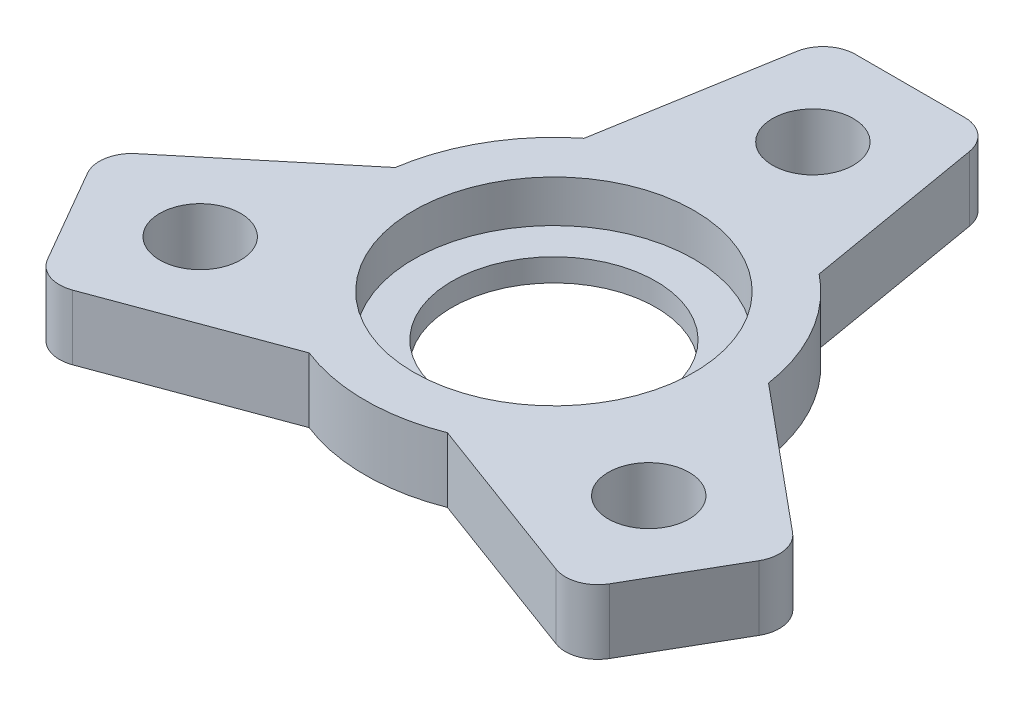
ISO-10303-21;
HEADER;
FILE_DESCRIPTION(('STEP AP214'),'2;1');
FILE_NAME('part.step','',(''),(''),'','','');
FILE_SCHEMA(('AUTOMOTIVE_DESIGN { 1 0 10303 214 1 1 1 1 }'));
ENDSEC;
DATA;
#1=APPLICATION_CONTEXT('core data for automotive mechanical design processes');
#2=APPLICATION_PROTOCOL_DEFINITION('international standard','automotive_design',2000,#1);
#3=PRODUCT_CONTEXT('',#1,'mechanical');
#4=PRODUCT('Part','Part','',(#3));
#5=PRODUCT_RELATED_PRODUCT_CATEGORY('part','',(#4));
#6=PRODUCT_DEFINITION_FORMATION('','',#4);
#7=PRODUCT_DEFINITION_CONTEXT('part definition',#1,'design');
#8=PRODUCT_DEFINITION('design','',#6,#7);
#9=PRODUCT_DEFINITION_SHAPE('','',#8);
#10=(LENGTH_UNIT() NAMED_UNIT(*) SI_UNIT(.MILLI.,.METRE.));
#11=(NAMED_UNIT(*) PLANE_ANGLE_UNIT() SI_UNIT($,.RADIAN.));
#12=(NAMED_UNIT(*) SI_UNIT($,.STERADIAN.) SOLID_ANGLE_UNIT());
#13=UNCERTAINTY_MEASURE_WITH_UNIT(LENGTH_MEASURE(1.E-05),#10,'distance_accuracy_value','');
#14=(GEOMETRIC_REPRESENTATION_CONTEXT(3) GLOBAL_UNCERTAINTY_ASSIGNED_CONTEXT((#13)) GLOBAL_UNIT_ASSIGNED_CONTEXT((#10,
#11,#12)) REPRESENTATION_CONTEXT('',''));
#15=CARTESIAN_POINT('',(0.,0.,0.));
#16=DIRECTION('',(0.,0.,1.));
#17=DIRECTION('',(1.,0.,0.));
#18=AXIS2_PLACEMENT_3D('',#15,#16,#17);
#19=CARTESIAN_POINT('',(0.,0.,0.));
#20=DIRECTION('',(0.,1.,0.));
#21=DIRECTION('',(0.,0.,1.));
#22=AXIS2_PLACEMENT_3D('',#19,#20,#21);
#23=PLANE('',#22);
#24=CARTESIAN_POINT('',(0.,0.,0.));
#25=DIRECTION('',(0.,1.,0.));
#26=DIRECTION('',(0.,0.,1.));
#27=AXIS2_PLACEMENT_3D('',#24,#25,#26);
#28=CIRCLE('',#27,8.);
#29=CARTESIAN_POINT('',(0.,0.,8.));
#30=VERTEX_POINT('',#29);
#31=EDGE_CURVE('E235',#30,#30,#28,.T.);
#32=ORIENTED_EDGE('',*,*,#31,.T.);
#33=EDGE_LOOP('',(#32));
#34=FACE_BOUND('',#33,.T.);
#35=DIRECTION('',(-0.499999999999992,0.,0.866025403784443));
#36=VECTOR('',#35,1.);
#37=CARTESIAN_POINT('',(24.1967497817373,0.,13.9699999999998));
#38=LINE('',#37,#36);
#39=CARTESIAN_POINT('',(26.3396179972549,0.,10.2584433767988));
#40=VERTEX_POINT('',#39);
#41=CARTESIAN_POINT('',(22.0538815662198,0.,17.6815566232007));
#42=VERTEX_POINT('',#41);
#43=EDGE_CURVE('E370',#40,#42,#38,.T.);
#44=ORIENTED_EDGE('',*,*,#43,.T.);
#45=CARTESIAN_POINT('',(19.8541770406073,0.,16.4115566232007));
#46=DIRECTION('',(0.,1.,0.));
#47=DIRECTION('',(0.,0.,1.));
#48=AXIS2_PLACEMENT_3D('',#45,#46,#47);
#49=CIRCLE('',#48,2.54);
#50=CARTESIAN_POINT('',(18.9727429635595,0.,18.7937140419745));
#51=VERTEX_POINT('',#50);
#52=EDGE_CURVE('E348',#42,#51,#49,.F.);
#53=ORIENTED_EDGE('',*,*,#52,.T.);
#54=DIRECTION('',(0.937857251485738,0.,0.34702129017629));
#55=VECTOR('',#54,1.);
#56=CARTESIAN_POINT('',(-3.83176579703126,0.,10.3557027781067));
#57=LINE('',#56,#55);
#58=CARTESIAN_POINT('',(5.42470429866146,0.,13.7807359481301));
#59=VERTEX_POINT('',#58);
#60=EDGE_CURVE('E183',#59,#51,#57,.T.);
#61=ORIENTED_EDGE('',*,*,#60,.F.);
#62=CARTESIAN_POINT('',(0.,0.,0.));
#63=DIRECTION('',(0.,1.,0.));
#64=DIRECTION('',(0.,0.,1.));
#65=AXIS2_PLACEMENT_3D('',#62,#63,#64);
#66=CIRCLE('',#65,14.81);
#67=CARTESIAN_POINT('',(-5.42470429866127,0.,13.7807359481301));
#68=VERTEX_POINT('',#67);
#69=EDGE_CURVE('E177',#68,#59,#66,.T.);
#70=ORIENTED_EDGE('',*,*,#69,.F.);
#71=DIRECTION('',(-0.937857251485733,0.,0.347021290176303));
#72=VECTOR('',#71,1.);
#73=CARTESIAN_POINT('',(3.83176579703141,0.,10.3557027781067));
#74=LINE('',#73,#72);
#75=CARTESIAN_POINT('',(-18.9727429635593,0.,18.7937140419748));
#76=VERTEX_POINT('',#75);
#77=EDGE_CURVE('E182',#68,#76,#74,.T.);
#78=ORIENTED_EDGE('',*,*,#77,.T.);
#79=CARTESIAN_POINT('',(-19.8541770406071,0.,16.411556623201));
#80=DIRECTION('',(0.,1.,0.));
#81=DIRECTION('',(0.,0.,1.));
#82=AXIS2_PLACEMENT_3D('',#79,#80,#81);
#83=CIRCLE('',#82,2.54);
#84=CARTESIAN_POINT('',(-22.0538815662195,0.,17.681556623201));
#85=VERTEX_POINT('',#84);
#86=EDGE_CURVE('E321',#76,#85,#83,.F.);
#87=ORIENTED_EDGE('',*,*,#86,.T.);
#88=DIRECTION('',(-0.500000000000004,0.,-0.866025403784436));
#89=VECTOR('',#88,1.);
#90=CARTESIAN_POINT('',(-24.1967497817372,0.,13.9700000000001));
#91=LINE('',#90,#89);
#92=CARTESIAN_POINT('',(-26.3396179972548,0.,10.2584433767992));
#93=VERTEX_POINT('',#92);
#94=EDGE_CURVE('E213',#85,#93,#91,.T.);
#95=ORIENTED_EDGE('',*,*,#94,.T.);
#96=CARTESIAN_POINT('',(-24.1399134716423,0.,8.98844337679918));
#97=DIRECTION('',(0.,1.,0.));
#98=DIRECTION('',(0.,0.,1.));
#99=AXIS2_PLACEMENT_3D('',#96,#97,#98);
#100=CIRCLE('',#99,2.54);
#101=CARTESIAN_POINT('',(-25.7622052735901,0.,7.03402036492763));
#102=VERTEX_POINT('',#101);
#103=EDGE_CURVE('E324',#93,#102,#100,.F.);
#104=ORIENTED_EDGE('',*,*,#103,.T.);
#105=DIRECTION('',(-0.769457878689591,0.,0.638697559821952));
#106=VECTOR('',#105,1.);
#107=CARTESIAN_POINT('',(-7.05241878136586,0.,-8.49625791063481));
#108=LINE('',#107,#106);
#109=CARTESIAN_POINT('',(-14.6468195632568,0.,-2.19243624340563));
#110=VERTEX_POINT('',#109);
#111=EDGE_CURVE('E207',#110,#102,#108,.T.);
#112=ORIENTED_EDGE('',*,*,#111,.F.);
#113=CARTESIAN_POINT('',(-9.22211526459544,0.,-11.5882997047244));
#114=VERTEX_POINT('',#113);
#115=EDGE_CURVE('E187',#114,#110,#66,.T.);
#116=ORIENTED_EDGE('',*,*,#115,.F.);
#117=DIRECTION('',(0.168399372796141,0.,-0.985718849998247));
#118=VECTOR('',#117,1.);
#119=CARTESIAN_POINT('',(-10.8841845783972,0.,-1.85944486747187));
#120=LINE('',#119,#118);
#121=CARTESIAN_POINT('',(-6.78946231003074,0.,-25.8277344069022));
#122=VERTEX_POINT('',#121);
#123=EDGE_CURVE('E240',#114,#122,#120,.T.);
#124=ORIENTED_EDGE('',*,*,#123,.T.);
#125=CARTESIAN_POINT('',(-4.2857364310352,0.,-25.4));
#126=DIRECTION('',(0.,1.,0.));
#127=DIRECTION('',(0.,0.,1.));
#128=AXIS2_PLACEMENT_3D('',#125,#126,#127);
#129=CIRCLE('',#128,2.54);
#130=CARTESIAN_POINT('',(-4.2857364310352,0.,-27.94));
#131=VERTEX_POINT('',#130);
#132=EDGE_CURVE('E295',#122,#131,#129,.F.);
#133=ORIENTED_EDGE('',*,*,#132,.T.);
#134=DIRECTION('',(1.,0.,0.));
#135=VECTOR('',#134,1.);
#136=CARTESIAN_POINT('',(0.,0.,-27.94));
#137=LINE('',#136,#135);
#138=CARTESIAN_POINT('',(4.28573643103519,0.,-27.94));
#139=VERTEX_POINT('',#138);
#140=EDGE_CURVE('E249',#131,#139,#137,.T.);
#141=ORIENTED_EDGE('',*,*,#140,.T.);
#142=CARTESIAN_POINT('',(4.28573643103519,0.,-25.4));
#143=DIRECTION('',(0.,1.,0.));
#144=DIRECTION('',(0.,0.,1.));
#145=AXIS2_PLACEMENT_3D('',#142,#143,#144);
#146=CIRCLE('',#145,2.54);
#147=CARTESIAN_POINT('',(6.78946231003074,0.,-25.8277344069022));
#148=VERTEX_POINT('',#147);
#149=EDGE_CURVE('E298',#139,#148,#146,.F.);
#150=ORIENTED_EDGE('',*,*,#149,.T.);
#151=DIRECTION('',(-0.168399372796141,0.,-0.985718849998247));
#152=VECTOR('',#151,1.);
#153=CARTESIAN_POINT('',(10.8841845783972,0.,-1.85944486747187));
#154=LINE('',#153,#152);
#155=CARTESIAN_POINT('',(9.22211526459544,0.,-11.5882997047244));
#156=VERTEX_POINT('',#155);
#157=EDGE_CURVE('E271',#156,#148,#154,.T.);
#158=ORIENTED_EDGE('',*,*,#157,.F.);
#159=CARTESIAN_POINT('',(14.6468195632567,0.,-2.19243624340584));
#160=VERTEX_POINT('',#159);
#161=EDGE_CURVE('E188',#160,#156,#66,.T.);
#162=ORIENTED_EDGE('',*,*,#161,.F.);
#163=DIRECTION('',(0.769457878689599,0.,0.638697559821941));
#164=VECTOR('',#163,1.);
#165=CARTESIAN_POINT('',(7.05241878136574,0.,-8.49625791063491));
#166=LINE('',#165,#164);
#167=CARTESIAN_POINT('',(25.7622052735901,0.,7.03402036492725));
#168=VERTEX_POINT('',#167);
#169=EDGE_CURVE('E373',#160,#168,#166,.T.);
#170=ORIENTED_EDGE('',*,*,#169,.T.);
#171=CARTESIAN_POINT('',(24.1399134716424,0.,8.98844337679884));
#172=DIRECTION('',(0.,1.,0.));
#173=DIRECTION('',(0.,0.,1.));
#174=AXIS2_PLACEMENT_3D('',#171,#172,#173);
#175=CIRCLE('',#174,2.54);
#176=EDGE_CURVE('E345',#168,#40,#175,.F.);
#177=ORIENTED_EDGE('',*,*,#176,.T.);
#178=EDGE_LOOP('',(#44,#53,#61,#70,#78,#87,#95,#104,#112,#116,#124,#133,#141,#150,#158,#162,
#170,#177));
#179=FACE_BOUND('',#178,.T.);
#180=CARTESIAN_POINT('',(0.,0.,-20.32));
#181=DIRECTION('',(0.,-1.,0.));
#182=DIRECTION('',(0.,0.,-1.));
#183=AXIS2_PLACEMENT_3D('',#180,#181,#182);
#184=CIRCLE('',#183,3.17499999999999);
#185=CARTESIAN_POINT('',(0.,0.,-23.495));
#186=VERTEX_POINT('',#185);
#187=EDGE_CURVE('E199',#186,#186,#184,.T.);
#188=ORIENTED_EDGE('',*,*,#187,.F.);
#189=EDGE_LOOP('',(#188));
#190=FACE_BOUND('',#189,.T.);
#191=CARTESIAN_POINT('',(-17.5976362048998,0.,10.1600000000001));
#192=DIRECTION('',(0.,-1.,0.));
#193=DIRECTION('',(0.,0.,-1.));
#194=AXIS2_PLACEMENT_3D('',#191,#192,#193);
#195=CIRCLE('',#194,3.17499999999999);
#196=CARTESIAN_POINT('',(-17.5976362048998,0.,6.9850000000001));
#197=VERTEX_POINT('',#196);
#198=EDGE_CURVE('E449',#197,#197,#195,.T.);
#199=ORIENTED_EDGE('',*,*,#198,.F.);
#200=EDGE_LOOP('',(#199));
#201=FACE_BOUND('',#200,.T.);
#202=CARTESIAN_POINT('',(17.5976362048999,0.,10.1599999999998));
#203=DIRECTION('',(0.,-1.,0.));
#204=DIRECTION('',(0.,0.,-1.));
#205=AXIS2_PLACEMENT_3D('',#202,#203,#204);
#206=CIRCLE('',#205,3.17499999999999);
#207=CARTESIAN_POINT('',(17.5976362048999,0.,6.98499999999985));
#208=VERTEX_POINT('',#207);
#209=EDGE_CURVE('E457',#208,#208,#206,.T.);
#210=ORIENTED_EDGE('',*,*,#209,.F.);
#211=EDGE_LOOP('',(#210));
#212=FACE_BOUND('',#211,.T.);
#213=ADVANCED_FACE('F47',(#34,#179,#190,#201,#212),#23,.F.);
#214=CARTESIAN_POINT('',(0.,5.08,0.));
#215=DIRECTION('',(0.,1.,0.));
#216=DIRECTION('',(0.,0.,1.));
#217=AXIS2_PLACEMENT_3D('',#214,#215,#216);
#218=PLANE('',#217);
#219=CARTESIAN_POINT('',(0.,5.08,-20.32));
#220=DIRECTION('',(0.,-1.,0.));
#221=DIRECTION('',(0.,0.,-1.));
#222=AXIS2_PLACEMENT_3D('',#219,#220,#221);
#223=CIRCLE('',#222,3.175);
#224=CARTESIAN_POINT('',(0.,5.08,-23.495));
#225=VERTEX_POINT('',#224);
#226=EDGE_CURVE('E231',#225,#225,#223,.T.);
#227=ORIENTED_EDGE('',*,*,#226,.T.);
#228=EDGE_LOOP('',(#227));
#229=FACE_BOUND('',#228,.T.);
#230=CARTESIAN_POINT('',(0.,5.08,0.));
#231=DIRECTION('',(0.,1.,0.));
#232=DIRECTION('',(0.,0.,1.));
#233=AXIS2_PLACEMENT_3D('',#230,#231,#232);
#234=CIRCLE('',#233,11.);
#235=CARTESIAN_POINT('',(0.,5.08,11.));
#236=VERTEX_POINT('',#235);
#237=EDGE_CURVE('E262',#236,#236,#234,.T.);
#238=ORIENTED_EDGE('',*,*,#237,.F.);
#239=EDGE_LOOP('',(#238));
#240=FACE_BOUND('',#239,.T.);
#241=DIRECTION('',(0.937857251485738,0.,0.34702129017629));
#242=VECTOR('',#241,1.);
#243=CARTESIAN_POINT('',(-3.83176579703126,5.08,10.3557027781067));
#244=LINE('',#243,#242);
#245=CARTESIAN_POINT('',(5.42470429866146,5.08,13.7807359481301));
#246=VERTEX_POINT('',#245);
#247=CARTESIAN_POINT('',(18.9727429635595,5.08,18.7937140419745));
#248=VERTEX_POINT('',#247);
#249=EDGE_CURVE('E360',#246,#248,#244,.T.);
#250=ORIENTED_EDGE('',*,*,#249,.T.);
#251=CARTESIAN_POINT('',(19.8541770406073,5.08,16.4115566232007));
#252=DIRECTION('',(0.,1.,0.));
#253=DIRECTION('',(0.,0.,1.));
#254=AXIS2_PLACEMENT_3D('',#251,#252,#253);
#255=CIRCLE('',#254,2.54);
#256=CARTESIAN_POINT('',(22.0538815662198,5.08,17.6815566232007));
#257=VERTEX_POINT('',#256);
#258=EDGE_CURVE('E56',#248,#257,#255,.T.);
#259=ORIENTED_EDGE('',*,*,#258,.T.);
#260=DIRECTION('',(-0.499999999999992,0.,0.866025403784443));
#261=VECTOR('',#260,1.);
#262=CARTESIAN_POINT('',(24.1967497817373,5.08,13.9699999999998));
#263=LINE('',#262,#261);
#264=CARTESIAN_POINT('',(26.3396179972549,5.08,10.2584433767988));
#265=VERTEX_POINT('',#264);
#266=EDGE_CURVE('E359',#265,#257,#263,.T.);
#267=ORIENTED_EDGE('',*,*,#266,.F.);
#268=CARTESIAN_POINT('',(24.1399134716424,5.08,8.98844337679884));
#269=DIRECTION('',(0.,1.,0.));
#270=DIRECTION('',(0.,0.,1.));
#271=AXIS2_PLACEMENT_3D('',#268,#269,#270);
#272=CIRCLE('',#271,2.54);
#273=CARTESIAN_POINT('',(25.7622052735901,5.08,7.03402036492725));
#274=VERTEX_POINT('',#273);
#275=EDGE_CURVE('E63',#265,#274,#272,.T.);
#276=ORIENTED_EDGE('',*,*,#275,.T.);
#277=DIRECTION('',(0.769457878689599,0.,0.638697559821941));
#278=VECTOR('',#277,1.);
#279=CARTESIAN_POINT('',(7.05241878136574,5.08,-8.49625791063491));
#280=LINE('',#279,#278);
#281=CARTESIAN_POINT('',(14.6468195632567,5.08,-2.19243624340584));
#282=VERTEX_POINT('',#281);
#283=EDGE_CURVE('E377',#282,#274,#280,.T.);
#284=ORIENTED_EDGE('',*,*,#283,.F.);
#285=CARTESIAN_POINT('',(0.,5.08,0.));
#286=DIRECTION('',(0.,1.,0.));
#287=DIRECTION('',(0.,0.,1.));
#288=AXIS2_PLACEMENT_3D('',#285,#286,#287);
#289=CIRCLE('',#288,14.81);
#290=CARTESIAN_POINT('',(9.22211526459544,5.08,-11.5882997047244));
#291=VERTEX_POINT('',#290);
#292=EDGE_CURVE('E248',#282,#291,#289,.T.);
#293=ORIENTED_EDGE('',*,*,#292,.T.);
#294=DIRECTION('',(-0.168399372796141,0.,-0.985718849998247));
#295=VECTOR('',#294,1.);
#296=CARTESIAN_POINT('',(10.8841845783972,5.08,-1.85944486747187));
#297=LINE('',#296,#295);
#298=CARTESIAN_POINT('',(6.78946231003074,5.08,-25.8277344069022));
#299=VERTEX_POINT('',#298);
#300=EDGE_CURVE('E254',#291,#299,#297,.T.);
#301=ORIENTED_EDGE('',*,*,#300,.T.);
#302=CARTESIAN_POINT('',(4.28573643103519,5.08,-25.4));
#303=DIRECTION('',(0.,1.,0.));
#304=DIRECTION('',(0.,0.,1.));
#305=AXIS2_PLACEMENT_3D('',#302,#303,#304);
#306=CIRCLE('',#305,2.54);
#307=CARTESIAN_POINT('',(4.28573643103519,5.08,-27.94));
#308=VERTEX_POINT('',#307);
#309=EDGE_CURVE('E307',#299,#308,#306,.T.);
#310=ORIENTED_EDGE('',*,*,#309,.T.);
#311=DIRECTION('',(1.,0.,0.));
#312=VECTOR('',#311,1.);
#313=CARTESIAN_POINT('',(0.,5.08,-27.94));
#314=LINE('',#313,#312);
#315=CARTESIAN_POINT('',(-4.2857364310352,5.08,-27.94));
#316=VERTEX_POINT('',#315);
#317=EDGE_CURVE('E258',#316,#308,#314,.T.);
#318=ORIENTED_EDGE('',*,*,#317,.F.);
#319=CARTESIAN_POINT('',(-4.2857364310352,5.08,-25.4));
#320=DIRECTION('',(0.,1.,0.));
#321=DIRECTION('',(0.,0.,1.));
#322=AXIS2_PLACEMENT_3D('',#319,#320,#321);
#323=CIRCLE('',#322,2.54);
#324=CARTESIAN_POINT('',(-6.78946231003074,5.08,-25.8277344069022));
#325=VERTEX_POINT('',#324);
#326=EDGE_CURVE('E304',#316,#325,#323,.T.);
#327=ORIENTED_EDGE('',*,*,#326,.T.);
#328=DIRECTION('',(0.168399372796141,0.,-0.985718849998247));
#329=VECTOR('',#328,1.);
#330=CARTESIAN_POINT('',(-10.8841845783972,5.08,-1.85944486747187));
#331=LINE('',#330,#329);
#332=CARTESIAN_POINT('',(-9.22211526459544,5.08,-11.5882997047244));
#333=VERTEX_POINT('',#332);
#334=EDGE_CURVE('E244',#333,#325,#331,.T.);
#335=ORIENTED_EDGE('',*,*,#334,.F.);
#336=CARTESIAN_POINT('',(-14.6468195632568,5.08,-2.19243624340563));
#337=VERTEX_POINT('',#336);
#338=EDGE_CURVE('E250',#333,#337,#289,.T.);
#339=ORIENTED_EDGE('',*,*,#338,.T.);
#340=DIRECTION('',(-0.769457878689591,0.,0.638697559821952));
#341=VECTOR('',#340,1.);
#342=CARTESIAN_POINT('',(-7.05241878136586,5.08,-8.49625791063481));
#343=LINE('',#342,#341);
#344=CARTESIAN_POINT('',(-25.7622052735901,5.08,7.03402036492763));
#345=VERTEX_POINT('',#344);
#346=EDGE_CURVE('E386',#337,#345,#343,.T.);
#347=ORIENTED_EDGE('',*,*,#346,.T.);
#348=CARTESIAN_POINT('',(-24.1399134716423,5.08,8.98844337679918));
#349=DIRECTION('',(0.,1.,0.));
#350=DIRECTION('',(0.,0.,1.));
#351=AXIS2_PLACEMENT_3D('',#348,#349,#350);
#352=CIRCLE('',#351,2.54);
#353=CARTESIAN_POINT('',(-26.3396179972548,5.08,10.2584433767992));
#354=VERTEX_POINT('',#353);
#355=EDGE_CURVE('E333',#345,#354,#352,.T.);
#356=ORIENTED_EDGE('',*,*,#355,.T.);
#357=DIRECTION('',(-0.500000000000004,0.,-0.866025403784436));
#358=VECTOR('',#357,1.);
#359=CARTESIAN_POINT('',(-24.1967497817372,5.08,13.9700000000001));
#360=LINE('',#359,#358);
#361=CARTESIAN_POINT('',(-22.0538815662195,5.08,17.681556623201));
#362=VERTEX_POINT('',#361);
#363=EDGE_CURVE('E218',#362,#354,#360,.T.);
#364=ORIENTED_EDGE('',*,*,#363,.F.);
#365=CARTESIAN_POINT('',(-19.8541770406071,5.08,16.411556623201));
#366=DIRECTION('',(0.,1.,0.));
#367=DIRECTION('',(0.,0.,1.));
#368=AXIS2_PLACEMENT_3D('',#365,#366,#367);
#369=CIRCLE('',#368,2.54);
#370=CARTESIAN_POINT('',(-18.9727429635593,5.08,18.7937140419748));
#371=VERTEX_POINT('',#370);
#372=EDGE_CURVE('E330',#362,#371,#369,.T.);
#373=ORIENTED_EDGE('',*,*,#372,.T.);
#374=DIRECTION('',(-0.937857251485733,0.,0.347021290176303));
#375=VECTOR('',#374,1.);
#376=CARTESIAN_POINT('',(3.83176579703141,5.08,10.3557027781067));
#377=LINE('',#376,#375);
#378=CARTESIAN_POINT('',(-5.42470429866126,5.08,13.7807359481301));
#379=VERTEX_POINT('',#378);
#380=EDGE_CURVE('E224',#379,#371,#377,.T.);
#381=ORIENTED_EDGE('',*,*,#380,.F.);
#382=EDGE_CURVE('E194',#379,#246,#289,.T.);
#383=ORIENTED_EDGE('',*,*,#382,.T.);
#384=EDGE_LOOP('',(#250,#259,#267,#276,#284,#293,#301,#310,#318,#327,#335,#339,#347,#356,#364,
#373,#381,#383));
#385=FACE_BOUND('',#384,.T.);
#386=CARTESIAN_POINT('',(-17.5976362048998,5.08,10.1600000000001));
#387=DIRECTION('',(0.,-1.,0.));
#388=DIRECTION('',(0.,0.,-1.));
#389=AXIS2_PLACEMENT_3D('',#386,#387,#388);
#390=CIRCLE('',#389,3.175);
#391=CARTESIAN_POINT('',(-17.5976362048998,5.08,6.98500000000008));
#392=VERTEX_POINT('',#391);
#393=EDGE_CURVE('E380',#392,#392,#390,.T.);
#394=ORIENTED_EDGE('',*,*,#393,.T.);
#395=EDGE_LOOP('',(#394));
#396=FACE_BOUND('',#395,.T.);
#397=CARTESIAN_POINT('',(17.5976362048999,5.08,10.1599999999998));
#398=DIRECTION('',(0.,-1.,0.));
#399=DIRECTION('',(0.,0.,-1.));
#400=AXIS2_PLACEMENT_3D('',#397,#398,#399);
#401=CIRCLE('',#400,3.175);
#402=CARTESIAN_POINT('',(17.5976362048999,5.08,6.98499999999984));
#403=VERTEX_POINT('',#402);
#404=EDGE_CURVE('E453',#403,#403,#401,.T.);
#405=ORIENTED_EDGE('',*,*,#404,.T.);
#406=EDGE_LOOP('',(#405));
#407=FACE_BOUND('',#406,.T.);
#408=ADVANCED_FACE('F357',(#229,#240,#385,#396,#407),#218,.T.);
#409=CARTESIAN_POINT('',(0.,5.08,0.));
#410=DIRECTION('',(0.,-1.,0.));
#411=DIRECTION('',(0.,0.,-1.));
#412=AXIS2_PLACEMENT_3D('',#409,#410,#411);
#413=CYLINDRICAL_SURFACE('',#412,14.81);
#414=DIRECTION('',(0.,-1.,0.));
#415=VECTOR('',#414,1.);
#416=CARTESIAN_POINT('',(-14.6468195632568,5.08,-2.19243624340562));
#417=LINE('',#416,#415);
#418=EDGE_CURVE('E200',#337,#110,#417,.T.);
#419=ORIENTED_EDGE('',*,*,#418,.F.);
#420=ORIENTED_EDGE('',*,*,#338,.F.);
#421=DIRECTION('',(0.,-1.,0.));
#422=VECTOR('',#421,1.);
#423=CARTESIAN_POINT('',(-9.22211526459544,5.08,-11.5882997047244));
#424=LINE('',#423,#422);
#425=EDGE_CURVE('E281',#333,#114,#424,.T.);
#426=ORIENTED_EDGE('',*,*,#425,.T.);
#427=ORIENTED_EDGE('',*,*,#115,.T.);
#428=EDGE_LOOP('',(#419,#420,#426,#427));
#429=FACE_BOUND('',#428,.T.);
#430=ADVANCED_FACE('F409',(#429),#413,.T.);
#431=ORIENTED_EDGE('',*,*,#382,.F.);
#432=DIRECTION('',(0.,-1.,0.));
#433=VECTOR('',#432,1.);
#434=CARTESIAN_POINT('',(-5.42470429866127,5.08,13.7807359481301));
#435=LINE('',#434,#433);
#436=EDGE_CURVE('E191',#379,#68,#435,.T.);
#437=ORIENTED_EDGE('',*,*,#436,.T.);
#438=ORIENTED_EDGE('',*,*,#69,.T.);
#439=DIRECTION('',(0.,-1.,0.));
#440=VECTOR('',#439,1.);
#441=CARTESIAN_POINT('',(5.42470429866146,5.08,13.78073594813));
#442=LINE('',#441,#440);
#443=EDGE_CURVE('E215',#246,#59,#442,.T.);
#444=ORIENTED_EDGE('',*,*,#443,.F.);
#445=EDGE_LOOP('',(#431,#437,#438,#444));
#446=FACE_BOUND('',#445,.T.);
#447=ADVANCED_FACE('F192',(#446),#413,.T.);
#448=CARTESIAN_POINT('',(-10.8841845783972,5.08,-1.85944486747187));
#449=DIRECTION('',(-0.985718849998247,0.,-0.168399372796141));
#450=DIRECTION('',(-0.168399372796141,0.,0.985718849998247));
#451=AXIS2_PLACEMENT_3D('',#448,#449,#450);
#452=PLANE('',#451);
#453=ORIENTED_EDGE('',*,*,#334,.T.);
#454=DIRECTION('',(0.,-1.,0.));
#455=VECTOR('',#454,1.);
#456=CARTESIAN_POINT('',(-6.78946231003074,5.08,-25.8277344069022));
#457=LINE('',#456,#455);
#458=EDGE_CURVE('E310',#325,#122,#457,.T.);
#459=ORIENTED_EDGE('',*,*,#458,.T.);
#460=ORIENTED_EDGE('',*,*,#123,.F.);
#461=ORIENTED_EDGE('',*,*,#425,.F.);
#462=EDGE_LOOP('',(#453,#459,#460,#461));
#463=FACE_BOUND('',#462,.T.);
#464=ADVANCED_FACE('F415',(#463),#452,.T.);
#465=ORIENTED_EDGE('',*,*,#292,.F.);
#466=DIRECTION('',(0.,-1.,0.));
#467=VECTOR('',#466,1.);
#468=CARTESIAN_POINT('',(14.6468195632567,5.08,-2.19243624340583));
#469=LINE('',#468,#467);
#470=EDGE_CURVE('E208',#282,#160,#469,.T.);
#471=ORIENTED_EDGE('',*,*,#470,.T.);
#472=ORIENTED_EDGE('',*,*,#161,.T.);
#473=DIRECTION('',(0.,-1.,0.));
#474=VECTOR('',#473,1.);
#475=CARTESIAN_POINT('',(9.22211526459544,5.08,-11.5882997047244));
#476=LINE('',#475,#474);
#477=EDGE_CURVE('E266',#291,#156,#476,.T.);
#478=ORIENTED_EDGE('',*,*,#477,.F.);
#479=EDGE_LOOP('',(#465,#471,#472,#478));
#480=FACE_BOUND('',#479,.T.);
#481=ADVANCED_FACE('F435',(#480),#413,.T.);
#482=CARTESIAN_POINT('',(10.8841845783972,5.08,-1.85944486747187));
#483=DIRECTION('',(-0.985718849998247,0.,0.168399372796141));
#484=DIRECTION('',(0.168399372796141,0.,0.985718849998247));
#485=AXIS2_PLACEMENT_3D('',#482,#483,#484);
#486=PLANE('',#485);
#487=ORIENTED_EDGE('',*,*,#157,.T.);
#488=DIRECTION('',(0.,-1.,0.));
#489=VECTOR('',#488,1.);
#490=CARTESIAN_POINT('',(6.78946231003074,5.08,-25.8277344069022));
#491=LINE('',#490,#489);
#492=EDGE_CURVE('E301',#148,#299,#491,.F.);
#493=ORIENTED_EDGE('',*,*,#492,.T.);
#494=ORIENTED_EDGE('',*,*,#300,.F.);
#495=ORIENTED_EDGE('',*,*,#477,.T.);
#496=EDGE_LOOP('',(#487,#493,#494,#495));
#497=FACE_BOUND('',#496,.T.);
#498=ADVANCED_FACE('F431',(#497),#486,.F.);
#499=CARTESIAN_POINT('',(0.,5.08,-27.94));
#500=DIRECTION('',(0.,0.,-1.));
#501=DIRECTION('',(-1.,0.,0.));
#502=AXIS2_PLACEMENT_3D('',#499,#500,#501);
#503=PLANE('',#502);
#504=ORIENTED_EDGE('',*,*,#317,.T.);
#505=DIRECTION('',(0.,-1.,0.));
#506=VECTOR('',#505,1.);
#507=CARTESIAN_POINT('',(4.28573643103519,0.,-27.94));
#508=LINE('',#507,#506);
#509=EDGE_CURVE('E291',#308,#139,#508,.T.);
#510=ORIENTED_EDGE('',*,*,#509,.T.);
#511=ORIENTED_EDGE('',*,*,#140,.F.);
#512=DIRECTION('',(0.,-1.,0.));
#513=VECTOR('',#512,1.);
#514=CARTESIAN_POINT('',(-4.2857364310352,5.08,-27.94));
#515=LINE('',#514,#513);
#516=EDGE_CURVE('E288',#131,#316,#515,.F.);
#517=ORIENTED_EDGE('',*,*,#516,.T.);
#518=EDGE_LOOP('',(#504,#510,#511,#517));
#519=FACE_BOUND('',#518,.T.);
#520=ADVANCED_FACE('F422',(#519),#503,.T.);
#521=CARTESIAN_POINT('',(0.,5.08,0.));
#522=DIRECTION('',(0.,-1.,0.));
#523=DIRECTION('',(0.,0.,-1.));
#524=AXIS2_PLACEMENT_3D('',#521,#522,#523);
#525=CYLINDRICAL_SURFACE('',#524,11.);
#526=CARTESIAN_POINT('',(0.,1.778,0.));
#527=DIRECTION('',(0.,1.,0.));
#528=DIRECTION('',(0.,0.,1.));
#529=AXIS2_PLACEMENT_3D('',#526,#527,#528);
#530=CIRCLE('',#529,11.);
#531=CARTESIAN_POINT('',(0.,1.778,11.));
#532=VERTEX_POINT('',#531);
#533=EDGE_CURVE('E284',#532,#532,#530,.T.);
#534=ORIENTED_EDGE('',*,*,#533,.F.);
#535=EDGE_LOOP('',(#534));
#536=FACE_BOUND('',#535,.T.);
#537=ORIENTED_EDGE('',*,*,#237,.T.);
#538=EDGE_LOOP('',(#537));
#539=FACE_BOUND('',#538,.T.);
#540=ADVANCED_FACE('F475',(#536,#539),#525,.F.);
#541=CARTESIAN_POINT('',(0.,1.778,0.));
#542=DIRECTION('',(0.,-1.,0.));
#543=DIRECTION('',(0.,0.,-1.));
#544=AXIS2_PLACEMENT_3D('',#541,#542,#543);
#545=CYLINDRICAL_SURFACE('',#544,8.);
#546=CARTESIAN_POINT('',(0.,1.778,0.));
#547=DIRECTION('',(0.,1.,0.));
#548=DIRECTION('',(0.,0.,1.));
#549=AXIS2_PLACEMENT_3D('',#546,#547,#548);
#550=CIRCLE('',#549,8.);
#551=CARTESIAN_POINT('',(0.,1.778,8.));
#552=VERTEX_POINT('',#551);
#553=EDGE_CURVE('E236',#552,#552,#550,.T.);
#554=ORIENTED_EDGE('',*,*,#553,.T.);
#555=EDGE_LOOP('',(#554));
#556=FACE_BOUND('',#555,.T.);
#557=ORIENTED_EDGE('',*,*,#31,.F.);
#558=EDGE_LOOP('',(#557));
#559=FACE_BOUND('',#558,.T.);
#560=ADVANCED_FACE('F478',(#556,#559),#545,.F.);
#561=CARTESIAN_POINT('',(0.,1.778,0.));
#562=DIRECTION('',(0.,1.,0.));
#563=DIRECTION('',(0.,0.,1.));
#564=AXIS2_PLACEMENT_3D('',#561,#562,#563);
#565=PLANE('',#564);
#566=ORIENTED_EDGE('',*,*,#553,.F.);
#567=EDGE_LOOP('',(#566));
#568=FACE_BOUND('',#567,.T.);
#569=ORIENTED_EDGE('',*,*,#533,.T.);
#570=EDGE_LOOP('',(#569));
#571=FACE_BOUND('',#570,.T.);
#572=ADVANCED_FACE('F525',(#568,#571),#565,.T.);
#573=CARTESIAN_POINT('',(0.,0.,-20.32));
#574=DIRECTION('',(0.,-1.,0.));
#575=DIRECTION('',(0.,0.,-1.));
#576=AXIS2_PLACEMENT_3D('',#573,#574,#575);
#577=CYLINDRICAL_SURFACE('',#576,3.17499999999999);
#578=ORIENTED_EDGE('',*,*,#226,.F.);
#579=EDGE_LOOP('',(#578));
#580=FACE_BOUND('',#579,.T.);
#581=ORIENTED_EDGE('',*,*,#187,.T.);
#582=EDGE_LOOP('',(#581));
#583=FACE_BOUND('',#582,.T.);
#584=ADVANCED_FACE('F490',(#580,#583),#577,.F.);
#585=CARTESIAN_POINT('',(4.28573643103519,5.08,-25.4));
#586=DIRECTION('',(0.,1.,0.));
#587=DIRECTION('',(0.,0.,1.));
#588=AXIS2_PLACEMENT_3D('',#585,#586,#587);
#589=CYLINDRICAL_SURFACE('',#588,2.54);
#590=ORIENTED_EDGE('',*,*,#309,.F.);
#591=ORIENTED_EDGE('',*,*,#492,.F.);
#592=ORIENTED_EDGE('',*,*,#149,.F.);
#593=ORIENTED_EDGE('',*,*,#509,.F.);
#594=EDGE_LOOP('',(#590,#591,#592,#593));
#595=FACE_BOUND('',#594,.T.);
#596=ADVANCED_FACE('F426',(#595),#589,.T.);
#597=CARTESIAN_POINT('',(-4.2857364310352,5.08,-25.4));
#598=DIRECTION('',(0.,-1.,0.));
#599=DIRECTION('',(0.,0.,-1.));
#600=AXIS2_PLACEMENT_3D('',#597,#598,#599);
#601=CYLINDRICAL_SURFACE('',#600,2.54);
#602=ORIENTED_EDGE('',*,*,#326,.F.);
#603=ORIENTED_EDGE('',*,*,#516,.F.);
#604=ORIENTED_EDGE('',*,*,#132,.F.);
#605=ORIENTED_EDGE('',*,*,#458,.F.);
#606=EDGE_LOOP('',(#602,#603,#604,#605));
#607=FACE_BOUND('',#606,.T.);
#608=ADVANCED_FACE('F418',(#607),#601,.T.);
#609=CARTESIAN_POINT('',(24.1967497817373,5.08,13.9699999999998));
#610=DIRECTION('',(0.866025403784443,0.,0.499999999999992));
#611=DIRECTION('',(0.499999999999992,0.,-0.866025403784443));
#612=AXIS2_PLACEMENT_3D('',#609,#610,#611);
#613=PLANE('',#612);
#614=ORIENTED_EDGE('',*,*,#266,.T.);
#615=DIRECTION('',(0.,-1.,0.));
#616=VECTOR('',#615,1.);
#617=CARTESIAN_POINT('',(22.0538815662198,0.,17.6815566232007));
#618=LINE('',#617,#616);
#619=EDGE_CURVE('E341',#257,#42,#618,.T.);
#620=ORIENTED_EDGE('',*,*,#619,.T.);
#621=ORIENTED_EDGE('',*,*,#43,.F.);
#622=DIRECTION('',(0.,-1.,0.));
#623=VECTOR('',#622,1.);
#624=CARTESIAN_POINT('',(26.3396179972549,5.08,10.2584433767988));
#625=LINE('',#624,#623);
#626=EDGE_CURVE('E338',#40,#265,#625,.F.);
#627=ORIENTED_EDGE('',*,*,#626,.T.);
#628=EDGE_LOOP('',(#614,#620,#621,#627));
#629=FACE_BOUND('',#628,.T.);
#630=ADVANCED_FACE('F364',(#629),#613,.T.);
#631=CARTESIAN_POINT('',(7.05241878136574,5.08,-8.49625791063491));
#632=DIRECTION('',(0.638697559821941,0.,-0.769457878689599));
#633=DIRECTION('',(-0.7694578786896,0.,-0.638697559821941));
#634=AXIS2_PLACEMENT_3D('',#631,#632,#633);
#635=PLANE('',#634);
#636=ORIENTED_EDGE('',*,*,#283,.T.);
#637=DIRECTION('',(0.,-1.,0.));
#638=VECTOR('',#637,1.);
#639=CARTESIAN_POINT('',(25.7622052735901,5.08,7.03402036492726));
#640=LINE('',#639,#638);
#641=EDGE_CURVE('E11',#274,#168,#640,.T.);
#642=ORIENTED_EDGE('',*,*,#641,.T.);
#643=ORIENTED_EDGE('',*,*,#169,.F.);
#644=ORIENTED_EDGE('',*,*,#470,.F.);
#645=EDGE_LOOP('',(#636,#642,#643,#644));
#646=FACE_BOUND('',#645,.T.);
#647=ADVANCED_FACE('F506',(#646),#635,.T.);
#648=CARTESIAN_POINT('',(-3.83176579703126,5.08,10.3557027781067));
#649=DIRECTION('',(0.34702129017629,0.,-0.937857251485738));
#650=DIRECTION('',(-0.937857251485738,0.,-0.34702129017629));
#651=AXIS2_PLACEMENT_3D('',#648,#649,#650);
#652=PLANE('',#651);
#653=ORIENTED_EDGE('',*,*,#60,.T.);
#654=DIRECTION('',(0.,-1.,0.));
#655=VECTOR('',#654,1.);
#656=CARTESIAN_POINT('',(18.9727429635595,5.08,18.7937140419745));
#657=LINE('',#656,#655);
#658=EDGE_CURVE('E71',#51,#248,#657,.F.);
#659=ORIENTED_EDGE('',*,*,#658,.T.);
#660=ORIENTED_EDGE('',*,*,#249,.F.);
#661=ORIENTED_EDGE('',*,*,#443,.T.);
#662=EDGE_LOOP('',(#653,#659,#660,#661));
#663=FACE_BOUND('',#662,.T.);
#664=ADVANCED_FACE('F371',(#663),#652,.F.);
#665=CARTESIAN_POINT('',(3.83176579703141,5.08,10.3557027781067));
#666=DIRECTION('',(0.347021290176303,0.,0.937857251485733));
#667=DIRECTION('',(0.937857251485733,0.,-0.347021290176303));
#668=AXIS2_PLACEMENT_3D('',#665,#666,#667);
#669=PLANE('',#668);
#670=ORIENTED_EDGE('',*,*,#380,.T.);
#671=DIRECTION('',(0.,-1.,0.));
#672=VECTOR('',#671,1.);
#673=CARTESIAN_POINT('',(-18.9727429635593,5.08,18.7937140419748));
#674=LINE('',#673,#672);
#675=EDGE_CURVE('E205',#371,#76,#674,.T.);
#676=ORIENTED_EDGE('',*,*,#675,.T.);
#677=ORIENTED_EDGE('',*,*,#77,.F.);
#678=ORIENTED_EDGE('',*,*,#436,.F.);
#679=EDGE_LOOP('',(#670,#676,#677,#678));
#680=FACE_BOUND('',#679,.T.);
#681=ADVANCED_FACE('F203',(#680),#669,.T.);
#682=CARTESIAN_POINT('',(-7.05241878136586,5.08,-8.49625791063481));
#683=DIRECTION('',(0.638697559821951,0.,0.769457878689591));
#684=DIRECTION('',(0.769457878689591,0.,-0.638697559821951));
#685=AXIS2_PLACEMENT_3D('',#682,#683,#684);
#686=PLANE('',#685);
#687=ORIENTED_EDGE('',*,*,#111,.T.);
#688=DIRECTION('',(0.,-1.,0.));
#689=VECTOR('',#688,1.);
#690=CARTESIAN_POINT('',(-25.7622052735901,5.08,7.03402036492762));
#691=LINE('',#690,#689);
#692=EDGE_CURVE('E327',#102,#345,#691,.F.);
#693=ORIENTED_EDGE('',*,*,#692,.T.);
#694=ORIENTED_EDGE('',*,*,#346,.F.);
#695=ORIENTED_EDGE('',*,*,#418,.T.);
#696=EDGE_LOOP('',(#687,#693,#694,#695));
#697=FACE_BOUND('',#696,.T.);
#698=ADVANCED_FACE('F406',(#697),#686,.F.);
#699=CARTESIAN_POINT('',(-24.1967497817372,5.08,13.9700000000001));
#700=DIRECTION('',(-0.866025403784436,0.,0.500000000000004));
#701=DIRECTION('',(0.500000000000004,0.,0.866025403784436));
#702=AXIS2_PLACEMENT_3D('',#699,#700,#701);
#703=PLANE('',#702);
#704=ORIENTED_EDGE('',*,*,#363,.T.);
#705=DIRECTION('',(0.,-1.,0.));
#706=VECTOR('',#705,1.);
#707=CARTESIAN_POINT('',(-26.3396179972548,0.,10.2584433767992));
#708=LINE('',#707,#706);
#709=EDGE_CURVE('E317',#354,#93,#708,.T.);
#710=ORIENTED_EDGE('',*,*,#709,.T.);
#711=ORIENTED_EDGE('',*,*,#94,.F.);
#712=DIRECTION('',(0.,-1.,0.));
#713=VECTOR('',#712,1.);
#714=CARTESIAN_POINT('',(-22.0538815662195,5.08,17.681556623201));
#715=LINE('',#714,#713);
#716=EDGE_CURVE('E314',#85,#362,#715,.F.);
#717=ORIENTED_EDGE('',*,*,#716,.T.);
#718=EDGE_LOOP('',(#704,#710,#711,#717));
#719=FACE_BOUND('',#718,.T.);
#720=ADVANCED_FACE('F396',(#719),#703,.T.);
#721=CARTESIAN_POINT('',(-17.5976362048998,0.,10.1600000000001));
#722=DIRECTION('',(0.,-1.,0.));
#723=DIRECTION('',(0.,0.,-1.));
#724=AXIS2_PLACEMENT_3D('',#721,#722,#723);
#725=CYLINDRICAL_SURFACE('',#724,3.17499999999999);
#726=ORIENTED_EDGE('',*,*,#393,.F.);
#727=EDGE_LOOP('',(#726));
#728=FACE_BOUND('',#727,.T.);
#729=ORIENTED_EDGE('',*,*,#198,.T.);
#730=EDGE_LOOP('',(#729));
#731=FACE_BOUND('',#730,.T.);
#732=ADVANCED_FACE('F518',(#728,#731),#725,.F.);
#733=CARTESIAN_POINT('',(17.5976362048999,0.,10.1599999999998));
#734=DIRECTION('',(0.,-1.,0.));
#735=DIRECTION('',(0.,0.,-1.));
#736=AXIS2_PLACEMENT_3D('',#733,#734,#735);
#737=CYLINDRICAL_SURFACE('',#736,3.17499999999999);
#738=ORIENTED_EDGE('',*,*,#404,.F.);
#739=EDGE_LOOP('',(#738));
#740=FACE_BOUND('',#739,.T.);
#741=ORIENTED_EDGE('',*,*,#209,.T.);
#742=EDGE_LOOP('',(#741));
#743=FACE_BOUND('',#742,.T.);
#744=ADVANCED_FACE('F462',(#740,#743),#737,.F.);
#745=CARTESIAN_POINT('',(-24.1399134716423,5.08,8.98844337679918));
#746=DIRECTION('',(0.,1.,0.));
#747=DIRECTION('',(0.,0.,1.));
#748=AXIS2_PLACEMENT_3D('',#745,#746,#747);
#749=CYLINDRICAL_SURFACE('',#748,2.54);
#750=ORIENTED_EDGE('',*,*,#355,.F.);
#751=ORIENTED_EDGE('',*,*,#692,.F.);
#752=ORIENTED_EDGE('',*,*,#103,.F.);
#753=ORIENTED_EDGE('',*,*,#709,.F.);
#754=EDGE_LOOP('',(#750,#751,#752,#753));
#755=FACE_BOUND('',#754,.T.);
#756=ADVANCED_FACE('F401',(#755),#749,.T.);
#757=CARTESIAN_POINT('',(-19.8541770406071,5.08,16.411556623201));
#758=DIRECTION('',(0.,-1.,0.));
#759=DIRECTION('',(0.,0.,-1.));
#760=AXIS2_PLACEMENT_3D('',#757,#758,#759);
#761=CYLINDRICAL_SURFACE('',#760,2.54);
#762=ORIENTED_EDGE('',*,*,#372,.F.);
#763=ORIENTED_EDGE('',*,*,#716,.F.);
#764=ORIENTED_EDGE('',*,*,#86,.F.);
#765=ORIENTED_EDGE('',*,*,#675,.F.);
#766=EDGE_LOOP('',(#762,#763,#764,#765));
#767=FACE_BOUND('',#766,.T.);
#768=ADVANCED_FACE('F494',(#767),#761,.T.);
#769=CARTESIAN_POINT('',(19.8541770406073,5.08,16.4115566232007));
#770=DIRECTION('',(0.,1.,0.));
#771=DIRECTION('',(0.,0.,1.));
#772=AXIS2_PLACEMENT_3D('',#769,#770,#771);
#773=CYLINDRICAL_SURFACE('',#772,2.54);
#774=ORIENTED_EDGE('',*,*,#258,.F.);
#775=ORIENTED_EDGE('',*,*,#658,.F.);
#776=ORIENTED_EDGE('',*,*,#52,.F.);
#777=ORIENTED_EDGE('',*,*,#619,.F.);
#778=EDGE_LOOP('',(#774,#775,#776,#777));
#779=FACE_BOUND('',#778,.T.);
#780=ADVANCED_FACE('F369',(#779),#773,.T.);
#781=CARTESIAN_POINT('',(24.1399134716424,5.08,8.98844337679884));
#782=DIRECTION('',(0.,-1.,0.));
#783=DIRECTION('',(0.,0.,-1.));
#784=AXIS2_PLACEMENT_3D('',#781,#782,#783);
#785=CYLINDRICAL_SURFACE('',#784,2.54);
#786=ORIENTED_EDGE('',*,*,#275,.F.);
#787=ORIENTED_EDGE('',*,*,#626,.F.);
#788=ORIENTED_EDGE('',*,*,#176,.F.);
#789=ORIENTED_EDGE('',*,*,#641,.F.);
#790=EDGE_LOOP('',(#786,#787,#788,#789));
#791=FACE_BOUND('',#790,.T.);
#792=ADVANCED_FACE('F49',(#791),#785,.T.);
#793=CLOSED_SHELL('',(#213,#408,#430,#447,#464,#481,#498,#520,#540,#560,#572,#584,#596,#608,
#630,#647,#664,#681,#698,#720,#732,#744,#756,#768,#780,#792));
#794=MANIFOLD_SOLID_BREP('B2',#793);
#795=ADVANCED_BREP_SHAPE_REPRESENTATION('',(#18,#794),#14);
#796=SHAPE_DEFINITION_REPRESENTATION(#9,#795);
ENDSEC;
END-ISO-10303-21;
